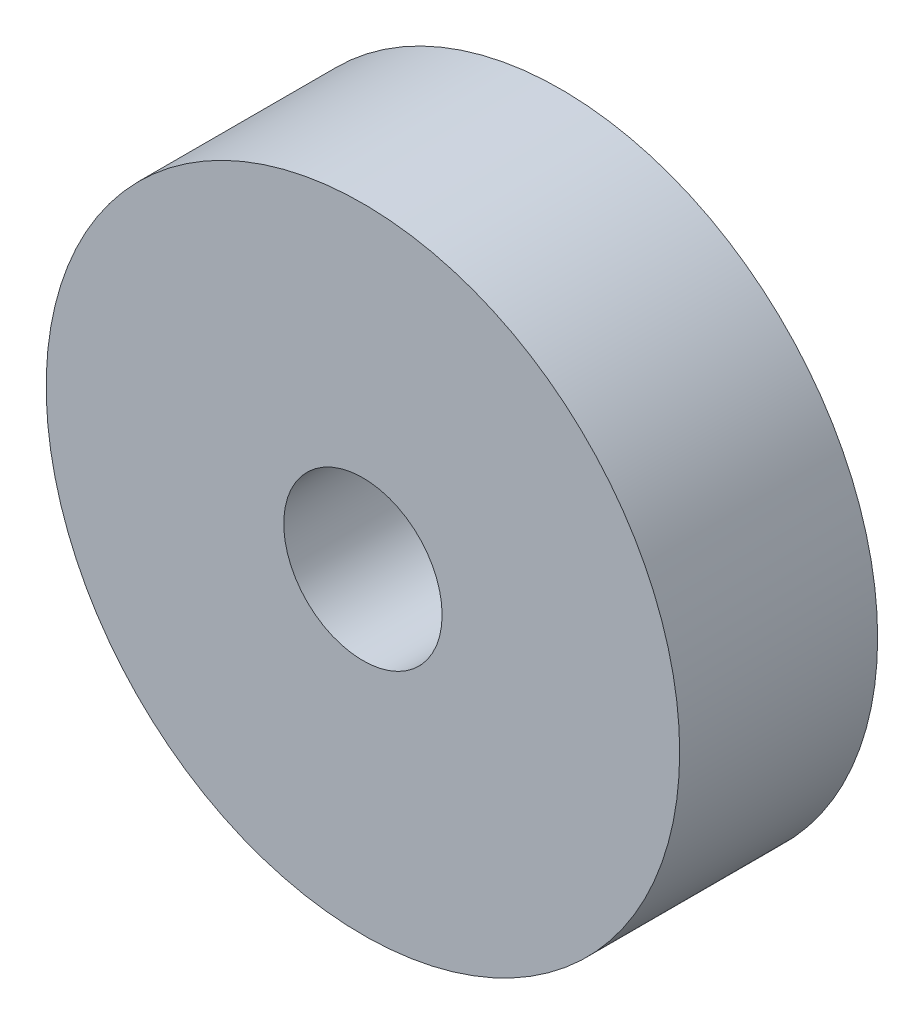
ISO-10303-21;
HEADER;
FILE_DESCRIPTION(('STEP AP214'),'2;1');
FILE_NAME('part.step','',(''),(''),'','','');
FILE_SCHEMA(('AUTOMOTIVE_DESIGN { 1 0 10303 214 1 1 1 1 }'));
ENDSEC;
DATA;
#1=APPLICATION_CONTEXT('core data for automotive mechanical design processes');
#2=APPLICATION_PROTOCOL_DEFINITION('international standard','automotive_design',2000,#1);
#3=PRODUCT_CONTEXT('',#1,'mechanical');
#4=PRODUCT('Part','Part','',(#3));
#5=PRODUCT_RELATED_PRODUCT_CATEGORY('part','',(#4));
#6=PRODUCT_DEFINITION_FORMATION('','',#4);
#7=PRODUCT_DEFINITION_CONTEXT('part definition',#1,'design');
#8=PRODUCT_DEFINITION('design','',#6,#7);
#9=PRODUCT_DEFINITION_SHAPE('','',#8);
#10=(LENGTH_UNIT() NAMED_UNIT(*) SI_UNIT(.MILLI.,.METRE.));
#11=(NAMED_UNIT(*) PLANE_ANGLE_UNIT() SI_UNIT($,.RADIAN.));
#12=(NAMED_UNIT(*) SI_UNIT($,.STERADIAN.) SOLID_ANGLE_UNIT());
#13=UNCERTAINTY_MEASURE_WITH_UNIT(LENGTH_MEASURE(1.E-05),#10,'distance_accuracy_value','');
#14=(GEOMETRIC_REPRESENTATION_CONTEXT(3) GLOBAL_UNCERTAINTY_ASSIGNED_CONTEXT((#13)) GLOBAL_UNIT_ASSIGNED_CONTEXT((#10,
#11,#12)) REPRESENTATION_CONTEXT('',''));
#15=CARTESIAN_POINT('',(0.,0.,0.));
#16=DIRECTION('',(0.,0.,1.));
#17=DIRECTION('',(1.,0.,0.));
#18=AXIS2_PLACEMENT_3D('',#15,#16,#17);
#19=CARTESIAN_POINT('',(0.,0.,5.));
#20=DIRECTION('',(0.,0.,1.));
#21=DIRECTION('',(1.,0.,0.));
#22=AXIS2_PLACEMENT_3D('',#19,#20,#21);
#23=PLANE('',#22);
#24=CARTESIAN_POINT('',(0.,0.,5.));
#25=DIRECTION('',(0.,0.,1.));
#26=DIRECTION('',(1.,0.,0.));
#27=AXIS2_PLACEMENT_3D('',#24,#25,#26);
#28=CIRCLE('',#27,8.);
#29=CARTESIAN_POINT('',(8.,0.,5.));
#30=VERTEX_POINT('',#29);
#31=EDGE_CURVE('E10',#30,#30,#28,.T.);
#32=ORIENTED_EDGE('',*,*,#31,.T.);
#33=EDGE_LOOP('',(#32));
#34=FACE_BOUND('',#33,.T.);
#35=CARTESIAN_POINT('',(0.,0.,5.));
#36=DIRECTION('',(0.,0.,1.));
#37=DIRECTION('',(1.,0.,0.));
#38=AXIS2_PLACEMENT_3D('',#35,#36,#37);
#39=CIRCLE('',#38,2.);
#40=CARTESIAN_POINT('',(2.,0.,5.));
#41=VERTEX_POINT('',#40);
#42=EDGE_CURVE('E49',#41,#41,#39,.T.);
#43=ORIENTED_EDGE('',*,*,#42,.F.);
#44=EDGE_LOOP('',(#43));
#45=FACE_BOUND('',#44,.T.);
#46=ADVANCED_FACE('F38',(#34,#45),#23,.T.);
#47=CARTESIAN_POINT('',(0.,0.,0.));
#48=DIRECTION('',(0.,0.,1.));
#49=DIRECTION('',(1.,0.,0.));
#50=AXIS2_PLACEMENT_3D('',#47,#48,#49);
#51=PLANE('',#50);
#52=CARTESIAN_POINT('',(0.,0.,0.));
#53=DIRECTION('',(0.,0.,1.));
#54=DIRECTION('',(1.,0.,0.));
#55=AXIS2_PLACEMENT_3D('',#52,#53,#54);
#56=CIRCLE('',#55,8.);
#57=CARTESIAN_POINT('',(8.,0.,0.));
#58=VERTEX_POINT('',#57);
#59=EDGE_CURVE('E42',#58,#58,#56,.T.);
#60=ORIENTED_EDGE('',*,*,#59,.F.);
#61=EDGE_LOOP('',(#60));
#62=FACE_BOUND('',#61,.T.);
#63=CARTESIAN_POINT('',(0.,0.,0.));
#64=DIRECTION('',(0.,0.,1.));
#65=DIRECTION('',(1.,0.,0.));
#66=AXIS2_PLACEMENT_3D('',#63,#64,#65);
#67=CIRCLE('',#66,2.);
#68=CARTESIAN_POINT('',(2.,0.,0.));
#69=VERTEX_POINT('',#68);
#70=EDGE_CURVE('E51',#69,#69,#67,.T.);
#71=ORIENTED_EDGE('',*,*,#70,.T.);
#72=EDGE_LOOP('',(#71));
#73=FACE_BOUND('',#72,.T.);
#74=ADVANCED_FACE('F61',(#62,#73),#51,.F.);
#75=CARTESIAN_POINT('',(0.,0.,5.));
#76=DIRECTION('',(0.,0.,-1.));
#77=DIRECTION('',(-1.,0.,0.));
#78=AXIS2_PLACEMENT_3D('',#75,#76,#77);
#79=CYLINDRICAL_SURFACE('',#78,8.);
#80=ORIENTED_EDGE('',*,*,#31,.F.);
#81=EDGE_LOOP('',(#80));
#82=FACE_BOUND('',#81,.T.);
#83=ORIENTED_EDGE('',*,*,#59,.T.);
#84=EDGE_LOOP('',(#83));
#85=FACE_BOUND('',#84,.T.);
#86=ADVANCED_FACE('F40',(#82,#85),#79,.T.);
#87=CARTESIAN_POINT('',(0.,0.,5.));
#88=DIRECTION('',(0.,0.,-1.));
#89=DIRECTION('',(-1.,0.,0.));
#90=AXIS2_PLACEMENT_3D('',#87,#88,#89);
#91=CYLINDRICAL_SURFACE('',#90,2.);
#92=ORIENTED_EDGE('',*,*,#42,.T.);
#93=EDGE_LOOP('',(#92));
#94=FACE_BOUND('',#93,.T.);
#95=ORIENTED_EDGE('',*,*,#70,.F.);
#96=EDGE_LOOP('',(#95));
#97=FACE_BOUND('',#96,.T.);
#98=ADVANCED_FACE('F57',(#94,#97),#91,.F.);
#99=CLOSED_SHELL('',(#46,#74,#86,#98));
#100=MANIFOLD_SOLID_BREP('B2',#99);
#101=ADVANCED_BREP_SHAPE_REPRESENTATION('',(#18,#100),#14);
#102=SHAPE_DEFINITION_REPRESENTATION(#9,#101);
ENDSEC;
END-ISO-10303-21;
